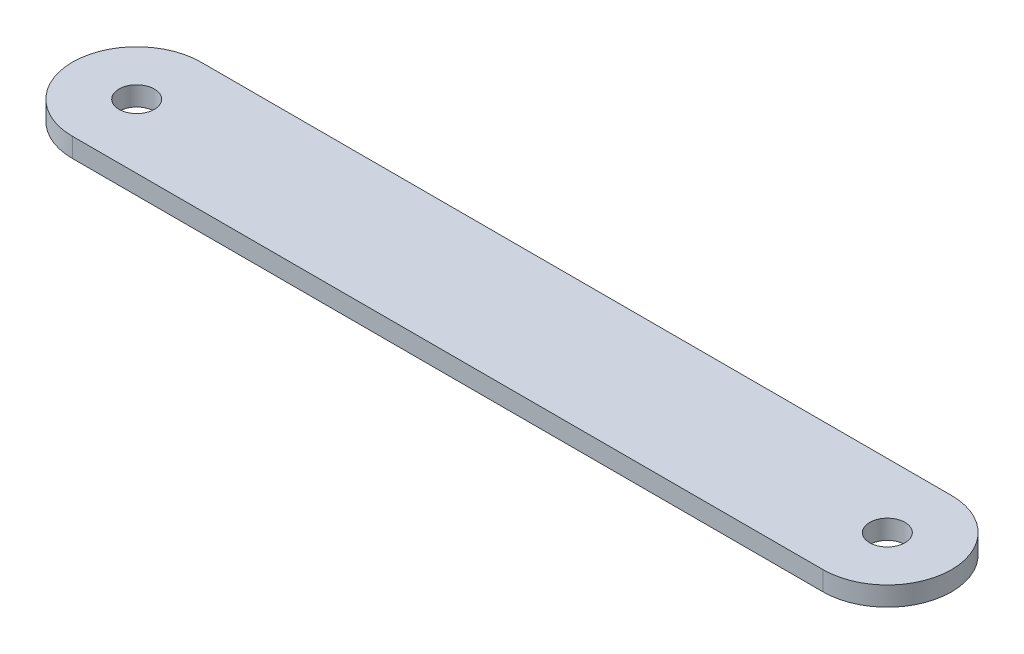
ISO-10303-21;
HEADER;
FILE_DESCRIPTION(('STEP AP214'),'2;1');
FILE_NAME('part.step','',(''),(''),'','','');
FILE_SCHEMA(('AUTOMOTIVE_DESIGN { 1 0 10303 214 1 1 1 1 }'));
ENDSEC;
DATA;
#1=APPLICATION_CONTEXT('core data for automotive mechanical design processes');
#2=APPLICATION_PROTOCOL_DEFINITION('international standard','automotive_design',2000,#1);
#3=PRODUCT_CONTEXT('',#1,'mechanical');
#4=PRODUCT('Part','Part','',(#3));
#5=PRODUCT_RELATED_PRODUCT_CATEGORY('part','',(#4));
#6=PRODUCT_DEFINITION_FORMATION('','',#4);
#7=PRODUCT_DEFINITION_CONTEXT('part definition',#1,'design');
#8=PRODUCT_DEFINITION('design','',#6,#7);
#9=PRODUCT_DEFINITION_SHAPE('','',#8);
#10=(LENGTH_UNIT() NAMED_UNIT(*) SI_UNIT(.MILLI.,.METRE.));
#11=(NAMED_UNIT(*) PLANE_ANGLE_UNIT() SI_UNIT($,.RADIAN.));
#12=(NAMED_UNIT(*) SI_UNIT($,.STERADIAN.) SOLID_ANGLE_UNIT());
#13=UNCERTAINTY_MEASURE_WITH_UNIT(LENGTH_MEASURE(1.E-05),#10,'distance_accuracy_value','');
#14=(GEOMETRIC_REPRESENTATION_CONTEXT(3) GLOBAL_UNCERTAINTY_ASSIGNED_CONTEXT((#13)) GLOBAL_UNIT_ASSIGNED_CONTEXT((#10,
#11,#12)) REPRESENTATION_CONTEXT('',''));
#15=CARTESIAN_POINT('',(0.,0.,0.));
#16=DIRECTION('',(0.,0.,1.));
#17=DIRECTION('',(1.,0.,0.));
#18=AXIS2_PLACEMENT_3D('',#15,#16,#17);
#19=CARTESIAN_POINT('',(116.85,3.,0.));
#20=DIRECTION('',(0.,-1.,0.));
#21=DIRECTION('',(0.,0.,-1.));
#22=AXIS2_PLACEMENT_3D('',#19,#20,#21);
#23=CYLINDRICAL_SURFACE('',#22,20.);
#24=CARTESIAN_POINT('',(116.85,-3.,0.));
#25=DIRECTION('',(0.,1.,0.));
#26=DIRECTION('',(0.,0.,1.));
#27=AXIS2_PLACEMENT_3D('',#24,#25,#26);
#28=CIRCLE('',#27,20.);
#29=CARTESIAN_POINT('',(116.85,-3.,20.));
#30=VERTEX_POINT('',#29);
#31=CARTESIAN_POINT('',(116.85,-3.,-20.));
#32=VERTEX_POINT('',#31);
#33=EDGE_CURVE('E100',#30,#32,#28,.T.);
#34=ORIENTED_EDGE('',*,*,#33,.T.);
#35=DIRECTION('',(0.,-1.,0.));
#36=VECTOR('',#35,1.);
#37=CARTESIAN_POINT('',(116.85,3.,-20.));
#38=LINE('',#37,#36);
#39=CARTESIAN_POINT('',(116.85,3.,-20.));
#40=VERTEX_POINT('',#39);
#41=EDGE_CURVE('E11',#40,#32,#38,.T.);
#42=ORIENTED_EDGE('',*,*,#41,.F.);
#43=CARTESIAN_POINT('',(116.85,3.,0.));
#44=DIRECTION('',(0.,1.,0.));
#45=DIRECTION('',(0.,0.,1.));
#46=AXIS2_PLACEMENT_3D('',#43,#44,#45);
#47=CIRCLE('',#46,20.);
#48=CARTESIAN_POINT('',(116.85,3.,20.));
#49=VERTEX_POINT('',#48);
#50=EDGE_CURVE('E87',#49,#40,#47,.T.);
#51=ORIENTED_EDGE('',*,*,#50,.F.);
#52=DIRECTION('',(0.,-1.,0.));
#53=VECTOR('',#52,1.);
#54=CARTESIAN_POINT('',(116.85,3.,20.));
#55=LINE('',#54,#53);
#56=EDGE_CURVE('E96',#49,#30,#55,.T.);
#57=ORIENTED_EDGE('',*,*,#56,.T.);
#58=EDGE_LOOP('',(#34,#42,#51,#57));
#59=FACE_BOUND('',#58,.T.);
#60=ADVANCED_FACE('F34',(#59),#23,.T.);
#61=CARTESIAN_POINT('',(116.85,3.,-20.));
#62=DIRECTION('',(0.,0.,1.));
#63=DIRECTION('',(1.,0.,0.));
#64=AXIS2_PLACEMENT_3D('',#61,#62,#63);
#65=PLANE('',#64);
#66=DIRECTION('',(-1.,0.,0.));
#67=VECTOR('',#66,1.);
#68=CARTESIAN_POINT('',(116.85,-3.,-20.));
#69=LINE('',#68,#67);
#70=CARTESIAN_POINT('',(-116.85,-3.,-20.));
#71=VERTEX_POINT('',#70);
#72=EDGE_CURVE('E91',#32,#71,#69,.T.);
#73=ORIENTED_EDGE('',*,*,#72,.T.);
#74=DIRECTION('',(0.,-1.,0.));
#75=VECTOR('',#74,1.);
#76=CARTESIAN_POINT('',(-116.85,3.,-20.));
#77=LINE('',#76,#75);
#78=CARTESIAN_POINT('',(-116.85,3.,-20.));
#79=VERTEX_POINT('',#78);
#80=EDGE_CURVE('E43',#79,#71,#77,.T.);
#81=ORIENTED_EDGE('',*,*,#80,.F.);
#82=DIRECTION('',(-1.,0.,0.));
#83=VECTOR('',#82,1.);
#84=CARTESIAN_POINT('',(116.85,3.,-20.));
#85=LINE('',#84,#83);
#86=EDGE_CURVE('E82',#40,#79,#85,.T.);
#87=ORIENTED_EDGE('',*,*,#86,.F.);
#88=ORIENTED_EDGE('',*,*,#41,.T.);
#89=EDGE_LOOP('',(#73,#81,#87,#88));
#90=FACE_BOUND('',#89,.T.);
#91=ADVANCED_FACE('F90',(#90),#65,.F.);
#92=CARTESIAN_POINT('',(-116.85,3.,0.));
#93=DIRECTION('',(0.,-1.,0.));
#94=DIRECTION('',(0.,0.,-1.));
#95=AXIS2_PLACEMENT_3D('',#92,#93,#94);
#96=CYLINDRICAL_SURFACE('',#95,20.);
#97=CARTESIAN_POINT('',(-116.85,-3.,0.));
#98=DIRECTION('',(0.,1.,0.));
#99=DIRECTION('',(0.,0.,1.));
#100=AXIS2_PLACEMENT_3D('',#97,#98,#99);
#101=CIRCLE('',#100,20.);
#102=CARTESIAN_POINT('',(-116.85,-3.,20.));
#103=VERTEX_POINT('',#102);
#104=EDGE_CURVE('E69',#71,#103,#101,.T.);
#105=ORIENTED_EDGE('',*,*,#104,.T.);
#106=DIRECTION('',(0.,-1.,0.));
#107=VECTOR('',#106,1.);
#108=CARTESIAN_POINT('',(-116.85,3.,20.));
#109=LINE('',#108,#107);
#110=CARTESIAN_POINT('',(-116.85,3.,20.));
#111=VERTEX_POINT('',#110);
#112=EDGE_CURVE('E92',#111,#103,#109,.T.);
#113=ORIENTED_EDGE('',*,*,#112,.F.);
#114=CARTESIAN_POINT('',(-116.85,3.,0.));
#115=DIRECTION('',(0.,1.,0.));
#116=DIRECTION('',(0.,0.,1.));
#117=AXIS2_PLACEMENT_3D('',#114,#115,#116);
#118=CIRCLE('',#117,20.);
#119=EDGE_CURVE('E85',#79,#111,#118,.T.);
#120=ORIENTED_EDGE('',*,*,#119,.F.);
#121=ORIENTED_EDGE('',*,*,#80,.T.);
#122=EDGE_LOOP('',(#105,#113,#120,#121));
#123=FACE_BOUND('',#122,.T.);
#124=ADVANCED_FACE('F94',(#123),#96,.T.);
#125=CARTESIAN_POINT('',(116.85,3.,20.));
#126=DIRECTION('',(0.,0.,-1.));
#127=DIRECTION('',(-1.,0.,0.));
#128=AXIS2_PLACEMENT_3D('',#125,#126,#127);
#129=PLANE('',#128);
#130=DIRECTION('',(1.,0.,0.));
#131=VECTOR('',#130,1.);
#132=CARTESIAN_POINT('',(116.85,-3.,20.));
#133=LINE('',#132,#131);
#134=EDGE_CURVE('E75',#103,#30,#133,.T.);
#135=ORIENTED_EDGE('',*,*,#134,.T.);
#136=ORIENTED_EDGE('',*,*,#56,.F.);
#137=DIRECTION('',(1.,0.,0.));
#138=VECTOR('',#137,1.);
#139=CARTESIAN_POINT('',(116.85,3.,20.));
#140=LINE('',#139,#138);
#141=EDGE_CURVE('E52',#111,#49,#140,.T.);
#142=ORIENTED_EDGE('',*,*,#141,.F.);
#143=ORIENTED_EDGE('',*,*,#112,.T.);
#144=EDGE_LOOP('',(#135,#136,#142,#143));
#145=FACE_BOUND('',#144,.T.);
#146=ADVANCED_FACE('F127',(#145),#129,.F.);
#147=CARTESIAN_POINT('',(116.85,3.,0.));
#148=DIRECTION('',(0.,1.,0.));
#149=DIRECTION('',(0.,0.,1.));
#150=AXIS2_PLACEMENT_3D('',#147,#148,#149);
#151=PLANE('',#150);
#152=CARTESIAN_POINT('',(-116.85,3.,0.));
#153=DIRECTION('',(0.,1.,0.));
#154=DIRECTION('',(0.,0.,1.));
#155=AXIS2_PLACEMENT_3D('',#152,#153,#154);
#156=CIRCLE('',#155,5.50000000000002);
#157=CARTESIAN_POINT('',(-116.85,3.,5.50000000000002));
#158=VERTEX_POINT('',#157);
#159=EDGE_CURVE('E109',#158,#158,#156,.T.);
#160=ORIENTED_EDGE('',*,*,#159,.F.);
#161=EDGE_LOOP('',(#160));
#162=FACE_BOUND('',#161,.T.);
#163=CARTESIAN_POINT('',(116.85,3.,0.));
#164=DIRECTION('',(0.,1.,0.));
#165=DIRECTION('',(0.,0.,-1.));
#166=AXIS2_PLACEMENT_3D('',#163,#164,#165);
#167=CIRCLE('',#166,5.50000000000002);
#168=CARTESIAN_POINT('',(116.85,3.,-5.50000000000002));
#169=VERTEX_POINT('',#168);
#170=EDGE_CURVE('E114',#169,#169,#167,.T.);
#171=ORIENTED_EDGE('',*,*,#170,.F.);
#172=EDGE_LOOP('',(#171));
#173=FACE_BOUND('',#172,.T.);
#174=ORIENTED_EDGE('',*,*,#50,.T.);
#175=ORIENTED_EDGE('',*,*,#86,.T.);
#176=ORIENTED_EDGE('',*,*,#119,.T.);
#177=ORIENTED_EDGE('',*,*,#141,.T.);
#178=EDGE_LOOP('',(#174,#175,#176,#177));
#179=FACE_BOUND('',#178,.T.);
#180=ADVANCED_FACE('F83',(#162,#173,#179),#151,.T.);
#181=CARTESIAN_POINT('',(116.85,-3.,0.));
#182=DIRECTION('',(0.,1.,0.));
#183=DIRECTION('',(0.,0.,1.));
#184=AXIS2_PLACEMENT_3D('',#181,#182,#183);
#185=PLANE('',#184);
#186=CARTESIAN_POINT('',(-116.85,-3.,0.));
#187=DIRECTION('',(0.,1.,0.));
#188=DIRECTION('',(0.,0.,1.));
#189=AXIS2_PLACEMENT_3D('',#186,#187,#188);
#190=CIRCLE('',#189,5.50000000000002);
#191=CARTESIAN_POINT('',(-116.85,-3.,5.50000000000002));
#192=VERTEX_POINT('',#191);
#193=EDGE_CURVE('E37',#192,#192,#190,.T.);
#194=ORIENTED_EDGE('',*,*,#193,.T.);
#195=EDGE_LOOP('',(#194));
#196=FACE_BOUND('',#195,.T.);
#197=CARTESIAN_POINT('',(116.85,-3.,0.));
#198=DIRECTION('',(0.,1.,0.));
#199=DIRECTION('',(0.,0.,1.));
#200=AXIS2_PLACEMENT_3D('',#197,#198,#199);
#201=CIRCLE('',#200,5.50000000000002);
#202=CARTESIAN_POINT('',(116.85,-3.,5.50000000000002));
#203=VERTEX_POINT('',#202);
#204=EDGE_CURVE('E107',#203,#203,#201,.T.);
#205=ORIENTED_EDGE('',*,*,#204,.T.);
#206=EDGE_LOOP('',(#205));
#207=FACE_BOUND('',#206,.T.);
#208=ORIENTED_EDGE('',*,*,#33,.F.);
#209=ORIENTED_EDGE('',*,*,#134,.F.);
#210=ORIENTED_EDGE('',*,*,#104,.F.);
#211=ORIENTED_EDGE('',*,*,#72,.F.);
#212=EDGE_LOOP('',(#208,#209,#210,#211));
#213=FACE_BOUND('',#212,.T.);
#214=ADVANCED_FACE('F126',(#196,#207,#213),#185,.F.);
#215=CARTESIAN_POINT('',(116.85,-6.,0.));
#216=DIRECTION('',(0.,1.,0.));
#217=DIRECTION('',(0.,0.,1.));
#218=AXIS2_PLACEMENT_3D('',#215,#216,#217);
#219=CYLINDRICAL_SURFACE('',#218,5.50000000000002);
#220=ORIENTED_EDGE('',*,*,#170,.T.);
#221=EDGE_LOOP('',(#220));
#222=FACE_BOUND('',#221,.T.);
#223=ORIENTED_EDGE('',*,*,#204,.F.);
#224=EDGE_LOOP('',(#223));
#225=FACE_BOUND('',#224,.T.);
#226=ADVANCED_FACE('F122',(#222,#225),#219,.F.);
#227=CARTESIAN_POINT('',(-116.85,-6.,0.));
#228=DIRECTION('',(0.,1.,0.));
#229=DIRECTION('',(0.,0.,1.));
#230=AXIS2_PLACEMENT_3D('',#227,#228,#229);
#231=CYLINDRICAL_SURFACE('',#230,5.50000000000002);
#232=ORIENTED_EDGE('',*,*,#159,.T.);
#233=EDGE_LOOP('',(#232));
#234=FACE_BOUND('',#233,.T.);
#235=ORIENTED_EDGE('',*,*,#193,.F.);
#236=EDGE_LOOP('',(#235));
#237=FACE_BOUND('',#236,.T.);
#238=ADVANCED_FACE('F174',(#234,#237),#231,.F.);
#239=CLOSED_SHELL('',(#60,#91,#124,#146,#180,#214,#226,#238));
#240=MANIFOLD_SOLID_BREP('B2',#239);
#241=ADVANCED_BREP_SHAPE_REPRESENTATION('',(#18,#240),#14);
#242=SHAPE_DEFINITION_REPRESENTATION(#9,#241);
ENDSEC;
END-ISO-10303-21;
